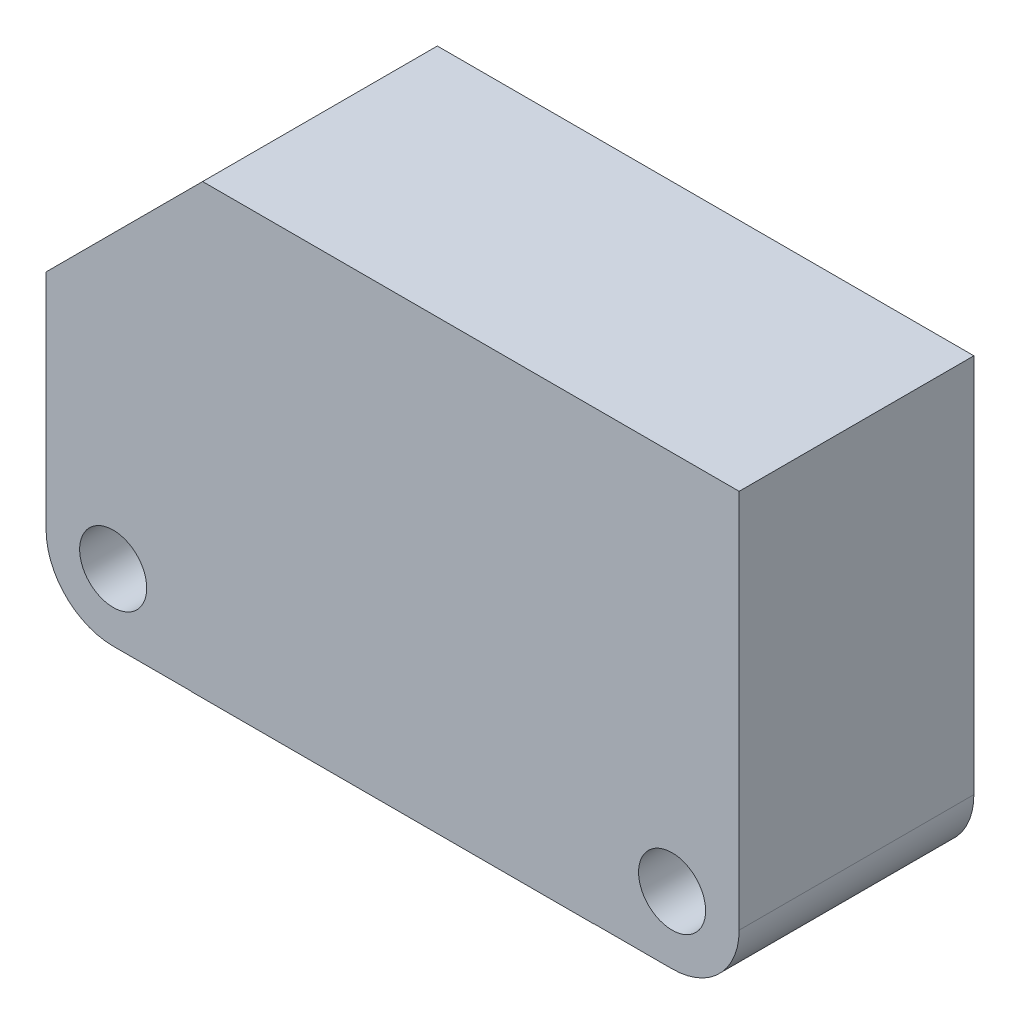
ISO-10303-21;
HEADER;
FILE_DESCRIPTION(('STEP AP214'),'2;1');
FILE_NAME('part.step','',(''),(''),'','','');
FILE_SCHEMA(('AUTOMOTIVE_DESIGN { 1 0 10303 214 1 1 1 1 }'));
ENDSEC;
DATA;
#1=APPLICATION_CONTEXT('core data for automotive mechanical design processes');
#2=APPLICATION_PROTOCOL_DEFINITION('international standard','automotive_design',2000,#1);
#3=PRODUCT_CONTEXT('',#1,'mechanical');
#4=PRODUCT('Part','Part','',(#3));
#5=PRODUCT_RELATED_PRODUCT_CATEGORY('part','',(#4));
#6=PRODUCT_DEFINITION_FORMATION('','',#4);
#7=PRODUCT_DEFINITION_CONTEXT('part definition',#1,'design');
#8=PRODUCT_DEFINITION('design','',#6,#7);
#9=PRODUCT_DEFINITION_SHAPE('','',#8);
#10=(LENGTH_UNIT() NAMED_UNIT(*) SI_UNIT(.MILLI.,.METRE.));
#11=(NAMED_UNIT(*) PLANE_ANGLE_UNIT() SI_UNIT($,.RADIAN.));
#12=(NAMED_UNIT(*) SI_UNIT($,.STERADIAN.) SOLID_ANGLE_UNIT());
#13=UNCERTAINTY_MEASURE_WITH_UNIT(LENGTH_MEASURE(1.E-05),#10,'distance_accuracy_value','');
#14=(GEOMETRIC_REPRESENTATION_CONTEXT(3) GLOBAL_UNCERTAINTY_ASSIGNED_CONTEXT((#13)) GLOBAL_UNIT_ASSIGNED_CONTEXT((#10,
#11,#12)) REPRESENTATION_CONTEXT('',''));
#15=CARTESIAN_POINT('',(0.,0.,0.));
#16=DIRECTION('',(0.,0.,1.));
#17=DIRECTION('',(1.,0.,0.));
#18=AXIS2_PLACEMENT_3D('',#15,#16,#17);
#19=CARTESIAN_POINT('',(0.,0.,-10.5));
#20=DIRECTION('',(0.,-1.,0.));
#21=DIRECTION('',(0.,0.,-1.));
#22=AXIS2_PLACEMENT_3D('',#19,#20,#21);
#23=PLANE('',#22);
#24=DIRECTION('',(1.,0.,0.));
#25=VECTOR('',#24,1.);
#26=CARTESIAN_POINT('',(0.,0.,-10.5));
#27=LINE('',#26,#25);
#28=CARTESIAN_POINT('',(3.,0.,-10.5));
#29=VERTEX_POINT('',#28);
#30=CARTESIAN_POINT('',(6.5,0.,-10.5));
#31=VERTEX_POINT('',#30);
#32=EDGE_CURVE('E163',#29,#31,#27,.T.);
#33=ORIENTED_EDGE('',*,*,#32,.T.);
#34=DIRECTION('',(0.,0.,-1.));
#35=VECTOR('',#34,1.);
#36=CARTESIAN_POINT('',(6.5,0.,0.));
#37=LINE('',#36,#35);
#38=CARTESIAN_POINT('',(6.5,0.,0.));
#39=VERTEX_POINT('',#38);
#40=EDGE_CURVE('E220',#39,#31,#37,.T.);
#41=ORIENTED_EDGE('',*,*,#40,.F.);
#42=DIRECTION('',(1.,0.,0.));
#43=VECTOR('',#42,1.);
#44=CARTESIAN_POINT('',(0.,0.,0.));
#45=LINE('',#44,#43);
#46=CARTESIAN_POINT('',(3.,0.,0.));
#47=VERTEX_POINT('',#46);
#48=EDGE_CURVE('E140',#47,#39,#45,.T.);
#49=ORIENTED_EDGE('',*,*,#48,.F.);
#50=DIRECTION('',(0.,0.,1.));
#51=VECTOR('',#50,1.);
#52=CARTESIAN_POINT('',(3.,0.,-10.5));
#53=LINE('',#52,#51);
#54=EDGE_CURVE('E188',#47,#29,#53,.F.);
#55=ORIENTED_EDGE('',*,*,#54,.T.);
#56=EDGE_LOOP('',(#33,#41,#49,#55));
#57=FACE_BOUND('',#56,.T.);
#58=ADVANCED_FACE('F34',(#57),#23,.T.);
#59=CARTESIAN_POINT('',(24.5,0.,0.));
#60=VERTEX_POINT('',#59);
#61=CARTESIAN_POINT('',(28.,0.,0.));
#62=VERTEX_POINT('',#61);
#63=EDGE_CURVE('E177',#60,#62,#45,.T.);
#64=ORIENTED_EDGE('',*,*,#63,.F.);
#65=DIRECTION('',(0.,0.,1.));
#66=VECTOR('',#65,1.);
#67=CARTESIAN_POINT('',(24.5,0.,-10.5));
#68=LINE('',#67,#66);
#69=CARTESIAN_POINT('',(24.5,0.,-10.5));
#70=VERTEX_POINT('',#69);
#71=EDGE_CURVE('E135',#70,#60,#68,.T.);
#72=ORIENTED_EDGE('',*,*,#71,.F.);
#73=CARTESIAN_POINT('',(28.,0.,-10.5));
#74=VERTEX_POINT('',#73);
#75=EDGE_CURVE('E161',#70,#74,#27,.T.);
#76=ORIENTED_EDGE('',*,*,#75,.T.);
#77=DIRECTION('',(0.,0.,1.));
#78=VECTOR('',#77,1.);
#79=CARTESIAN_POINT('',(28.,0.,-10.5));
#80=LINE('',#79,#78);
#81=EDGE_CURVE('E194',#74,#62,#80,.T.);
#82=ORIENTED_EDGE('',*,*,#81,.T.);
#83=EDGE_LOOP('',(#64,#72,#76,#82));
#84=FACE_BOUND('',#83,.T.);
#85=ADVANCED_FACE('F217',(#84),#23,.T.);
#86=CARTESIAN_POINT('',(0.,13.,-10.5));
#87=DIRECTION('',(-1.,0.,0.));
#88=DIRECTION('',(0.,-1.,0.));
#89=AXIS2_PLACEMENT_3D('',#86,#87,#88);
#90=PLANE('',#89);
#91=DIRECTION('',(0.,-1.,0.));
#92=VECTOR('',#91,1.);
#93=CARTESIAN_POINT('',(0.,13.,-10.5));
#94=LINE('',#93,#92);
#95=CARTESIAN_POINT('',(0.,13.,-10.5));
#96=VERTEX_POINT('',#95);
#97=CARTESIAN_POINT('',(0.,3.,-10.5));
#98=VERTEX_POINT('',#97);
#99=EDGE_CURVE('E159',#96,#98,#94,.T.);
#100=ORIENTED_EDGE('',*,*,#99,.T.);
#101=DIRECTION('',(0.,0.,1.));
#102=VECTOR('',#101,1.);
#103=CARTESIAN_POINT('',(0.,3.,-10.5));
#104=LINE('',#103,#102);
#105=CARTESIAN_POINT('',(0.,3.,0.));
#106=VERTEX_POINT('',#105);
#107=EDGE_CURVE('E11',#98,#106,#104,.T.);
#108=ORIENTED_EDGE('',*,*,#107,.T.);
#109=DIRECTION('',(0.,-1.,0.));
#110=VECTOR('',#109,1.);
#111=CARTESIAN_POINT('',(0.,13.,0.));
#112=LINE('',#111,#110);
#113=CARTESIAN_POINT('',(0.,13.,0.));
#114=VERTEX_POINT('',#113);
#115=EDGE_CURVE('E156',#114,#106,#112,.T.);
#116=ORIENTED_EDGE('',*,*,#115,.F.);
#117=DIRECTION('',(0.,0.,1.));
#118=VECTOR('',#117,1.);
#119=CARTESIAN_POINT('',(0.,13.,-10.5));
#120=LINE('',#119,#118);
#121=EDGE_CURVE('E186',#96,#114,#120,.T.);
#122=ORIENTED_EDGE('',*,*,#121,.F.);
#123=EDGE_LOOP('',(#100,#108,#116,#122));
#124=FACE_BOUND('',#123,.T.);
#125=ADVANCED_FACE('F233',(#124),#90,.T.);
#126=CARTESIAN_POINT('',(7.,20.,-10.5));
#127=DIRECTION('',(-0.707106781186546,0.707106781186549,0.));
#128=DIRECTION('',(-0.707106781186549,-0.707106781186546,0.));
#129=AXIS2_PLACEMENT_3D('',#126,#127,#128);
#130=PLANE('',#129);
#131=DIRECTION('',(-0.707106781186549,-0.707106781186546,0.));
#132=VECTOR('',#131,1.);
#133=CARTESIAN_POINT('',(7.,20.,0.));
#134=LINE('',#133,#132);
#135=CARTESIAN_POINT('',(7.,20.,0.));
#136=VERTEX_POINT('',#135);
#137=EDGE_CURVE('E162',#136,#114,#134,.T.);
#138=ORIENTED_EDGE('',*,*,#137,.F.);
#139=DIRECTION('',(0.,0.,1.));
#140=VECTOR('',#139,1.);
#141=CARTESIAN_POINT('',(7.,20.,-10.5));
#142=LINE('',#141,#140);
#143=CARTESIAN_POINT('',(7.,20.,-10.5));
#144=VERTEX_POINT('',#143);
#145=EDGE_CURVE('E189',#144,#136,#142,.T.);
#146=ORIENTED_EDGE('',*,*,#145,.F.);
#147=DIRECTION('',(-0.707106781186549,-0.707106781186546,0.));
#148=VECTOR('',#147,1.);
#149=CARTESIAN_POINT('',(7.,20.,-10.5));
#150=LINE('',#149,#148);
#151=EDGE_CURVE('E171',#144,#96,#150,.T.);
#152=ORIENTED_EDGE('',*,*,#151,.T.);
#153=ORIENTED_EDGE('',*,*,#121,.T.);
#154=EDGE_LOOP('',(#138,#146,#152,#153));
#155=FACE_BOUND('',#154,.T.);
#156=ADVANCED_FACE('F237',(#155),#130,.T.);
#157=CARTESIAN_POINT('',(31.,20.,-10.5));
#158=DIRECTION('',(0.,1.,0.));
#159=DIRECTION('',(0.,0.,1.));
#160=AXIS2_PLACEMENT_3D('',#157,#158,#159);
#161=PLANE('',#160);
#162=DIRECTION('',(-1.,0.,0.));
#163=VECTOR('',#162,1.);
#164=CARTESIAN_POINT('',(31.,20.,0.));
#165=LINE('',#164,#163);
#166=CARTESIAN_POINT('',(31.,20.,0.));
#167=VERTEX_POINT('',#166);
#168=EDGE_CURVE('E181',#167,#136,#165,.T.);
#169=ORIENTED_EDGE('',*,*,#168,.F.);
#170=DIRECTION('',(0.,0.,1.));
#171=VECTOR('',#170,1.);
#172=CARTESIAN_POINT('',(31.,20.,-10.5));
#173=LINE('',#172,#171);
#174=CARTESIAN_POINT('',(31.,20.,-10.5));
#175=VERTEX_POINT('',#174);
#176=EDGE_CURVE('E174',#175,#167,#173,.T.);
#177=ORIENTED_EDGE('',*,*,#176,.F.);
#178=DIRECTION('',(-1.,0.,0.));
#179=VECTOR('',#178,1.);
#180=CARTESIAN_POINT('',(31.,20.,-10.5));
#181=LINE('',#180,#179);
#182=EDGE_CURVE('E168',#175,#144,#181,.T.);
#183=ORIENTED_EDGE('',*,*,#182,.T.);
#184=ORIENTED_EDGE('',*,*,#145,.T.);
#185=EDGE_LOOP('',(#169,#177,#183,#184));
#186=FACE_BOUND('',#185,.T.);
#187=ADVANCED_FACE('F241',(#186),#161,.T.);
#188=CARTESIAN_POINT('',(31.,0.,-10.5));
#189=DIRECTION('',(1.,0.,0.));
#190=DIRECTION('',(0.,0.,-1.));
#191=AXIS2_PLACEMENT_3D('',#188,#189,#190);
#192=PLANE('',#191);
#193=DIRECTION('',(0.,1.,0.));
#194=VECTOR('',#193,1.);
#195=CARTESIAN_POINT('',(31.,0.,0.));
#196=LINE('',#195,#194);
#197=CARTESIAN_POINT('',(31.,3.,0.));
#198=VERTEX_POINT('',#197);
#199=EDGE_CURVE('E179',#198,#167,#196,.T.);
#200=ORIENTED_EDGE('',*,*,#199,.F.);
#201=DIRECTION('',(0.,0.,1.));
#202=VECTOR('',#201,1.);
#203=CARTESIAN_POINT('',(31.,3.,-10.5));
#204=LINE('',#203,#202);
#205=CARTESIAN_POINT('',(31.,3.,-10.5));
#206=VERTEX_POINT('',#205);
#207=EDGE_CURVE('E201',#198,#206,#204,.F.);
#208=ORIENTED_EDGE('',*,*,#207,.T.);
#209=DIRECTION('',(0.,1.,0.));
#210=VECTOR('',#209,1.);
#211=CARTESIAN_POINT('',(31.,0.,-10.5));
#212=LINE('',#211,#210);
#213=EDGE_CURVE('E166',#206,#175,#212,.T.);
#214=ORIENTED_EDGE('',*,*,#213,.T.);
#215=ORIENTED_EDGE('',*,*,#176,.T.);
#216=EDGE_LOOP('',(#200,#208,#214,#215));
#217=FACE_BOUND('',#216,.T.);
#218=ADVANCED_FACE('F244',(#217),#192,.T.);
#219=CARTESIAN_POINT('',(0.,0.,-10.5));
#220=DIRECTION('',(0.,0.,1.));
#221=DIRECTION('',(1.,0.,0.));
#222=AXIS2_PLACEMENT_3D('',#219,#220,#221);
#223=PLANE('',#222);
#224=CARTESIAN_POINT('',(28.,3.,-10.5));
#225=DIRECTION('',(0.,0.,1.));
#226=DIRECTION('',(1.,0.,0.));
#227=AXIS2_PLACEMENT_3D('',#224,#225,#226);
#228=CIRCLE('',#227,1.5);
#229=CARTESIAN_POINT('',(29.5,3.,-10.5));
#230=VERTEX_POINT('',#229);
#231=EDGE_CURVE('E144',#230,#230,#228,.T.);
#232=ORIENTED_EDGE('',*,*,#231,.T.);
#233=EDGE_LOOP('',(#232));
#234=FACE_BOUND('',#233,.T.);
#235=CARTESIAN_POINT('',(3.,3.,-10.5));
#236=DIRECTION('',(0.,0.,1.));
#237=DIRECTION('',(1.,0.,0.));
#238=AXIS2_PLACEMENT_3D('',#235,#236,#237);
#239=CIRCLE('',#238,1.5);
#240=CARTESIAN_POINT('',(4.5,3.,-10.5));
#241=VERTEX_POINT('',#240);
#242=EDGE_CURVE('E153',#241,#241,#239,.T.);
#243=ORIENTED_EDGE('',*,*,#242,.T.);
#244=EDGE_LOOP('',(#243));
#245=FACE_BOUND('',#244,.T.);
#246=ORIENTED_EDGE('',*,*,#213,.F.);
#247=CARTESIAN_POINT('',(28.,3.,-10.5));
#248=DIRECTION('',(0.,0.,1.));
#249=DIRECTION('',(1.,0.,0.));
#250=AXIS2_PLACEMENT_3D('',#247,#248,#249);
#251=CIRCLE('',#250,3.);
#252=EDGE_CURVE('E42',#206,#74,#251,.F.);
#253=ORIENTED_EDGE('',*,*,#252,.T.);
#254=ORIENTED_EDGE('',*,*,#75,.F.);
#255=DIRECTION('',(0.,1.,0.));
#256=VECTOR('',#255,1.);
#257=CARTESIAN_POINT('',(24.5,-0.01,-10.5));
#258=LINE('',#257,#256);
#259=CARTESIAN_POINT('',(24.5,-0.01,-10.5));
#260=VERTEX_POINT('',#259);
#261=EDGE_CURVE('E146',#260,#70,#258,.T.);
#262=ORIENTED_EDGE('',*,*,#261,.F.);
#263=DIRECTION('',(1.,0.,0.));
#264=VECTOR('',#263,1.);
#265=CARTESIAN_POINT('',(6.5,-0.01,-10.5));
#266=LINE('',#265,#264);
#267=CARTESIAN_POINT('',(6.5,-0.01,-10.5));
#268=VERTEX_POINT('',#267);
#269=EDGE_CURVE('E129',#268,#260,#266,.T.);
#270=ORIENTED_EDGE('',*,*,#269,.F.);
#271=DIRECTION('',(0.,1.,0.));
#272=VECTOR('',#271,1.);
#273=CARTESIAN_POINT('',(6.5,-0.01,-10.5));
#274=LINE('',#273,#272);
#275=EDGE_CURVE('E126',#268,#31,#274,.T.);
#276=ORIENTED_EDGE('',*,*,#275,.T.);
#277=ORIENTED_EDGE('',*,*,#32,.F.);
#278=CARTESIAN_POINT('',(3.,3.,-10.5));
#279=DIRECTION('',(0.,0.,1.));
#280=DIRECTION('',(1.,0.,0.));
#281=AXIS2_PLACEMENT_3D('',#278,#279,#280);
#282=CIRCLE('',#281,3.);
#283=EDGE_CURVE('E57',#29,#98,#282,.F.);
#284=ORIENTED_EDGE('',*,*,#283,.T.);
#285=ORIENTED_EDGE('',*,*,#99,.F.);
#286=ORIENTED_EDGE('',*,*,#151,.F.);
#287=ORIENTED_EDGE('',*,*,#182,.F.);
#288=EDGE_LOOP('',(#246,#253,#254,#262,#270,#276,#277,#284,#285,#286,#287));
#289=FACE_BOUND('',#288,.T.);
#290=ADVANCED_FACE('F208',(#234,#245,#289),#223,.F.);
#291=CARTESIAN_POINT('',(0.,0.,0.));
#292=DIRECTION('',(0.,0.,1.));
#293=DIRECTION('',(1.,0.,0.));
#294=AXIS2_PLACEMENT_3D('',#291,#292,#293);
#295=PLANE('',#294);
#296=CARTESIAN_POINT('',(28.,3.,0.));
#297=DIRECTION('',(0.,0.,1.));
#298=DIRECTION('',(1.,0.,0.));
#299=AXIS2_PLACEMENT_3D('',#296,#297,#298);
#300=CIRCLE('',#299,1.5);
#301=CARTESIAN_POINT('',(29.5,3.,0.));
#302=VERTEX_POINT('',#301);
#303=EDGE_CURVE('E141',#302,#302,#300,.T.);
#304=ORIENTED_EDGE('',*,*,#303,.F.);
#305=EDGE_LOOP('',(#304));
#306=FACE_BOUND('',#305,.T.);
#307=CARTESIAN_POINT('',(3.,3.,0.));
#308=DIRECTION('',(0.,0.,1.));
#309=DIRECTION('',(1.,0.,0.));
#310=AXIS2_PLACEMENT_3D('',#307,#308,#309);
#311=CIRCLE('',#310,1.5);
#312=CARTESIAN_POINT('',(4.5,3.,0.));
#313=VERTEX_POINT('',#312);
#314=EDGE_CURVE('E151',#313,#313,#311,.T.);
#315=ORIENTED_EDGE('',*,*,#314,.F.);
#316=EDGE_LOOP('',(#315));
#317=FACE_BOUND('',#316,.T.);
#318=ORIENTED_EDGE('',*,*,#48,.T.);
#319=DIRECTION('',(0.,1.,0.));
#320=VECTOR('',#319,1.);
#321=CARTESIAN_POINT('',(6.5,-0.01,0.));
#322=LINE('',#321,#320);
#323=CARTESIAN_POINT('',(6.5,-0.01,0.));
#324=VERTEX_POINT('',#323);
#325=EDGE_CURVE('E123',#324,#39,#322,.T.);
#326=ORIENTED_EDGE('',*,*,#325,.F.);
#327=DIRECTION('',(-1.,0.,0.));
#328=VECTOR('',#327,1.);
#329=CARTESIAN_POINT('',(24.5,-0.01,0.));
#330=LINE('',#329,#328);
#331=CARTESIAN_POINT('',(24.5,-0.01,0.));
#332=VERTEX_POINT('',#331);
#333=EDGE_CURVE('E130',#332,#324,#330,.T.);
#334=ORIENTED_EDGE('',*,*,#333,.F.);
#335=DIRECTION('',(0.,1.,0.));
#336=VECTOR('',#335,1.);
#337=CARTESIAN_POINT('',(24.5,-0.01,0.));
#338=LINE('',#337,#336);
#339=EDGE_CURVE('E49',#332,#60,#338,.T.);
#340=ORIENTED_EDGE('',*,*,#339,.T.);
#341=ORIENTED_EDGE('',*,*,#63,.T.);
#342=CARTESIAN_POINT('',(28.,3.,0.));
#343=DIRECTION('',(0.,0.,1.));
#344=DIRECTION('',(1.,0.,0.));
#345=AXIS2_PLACEMENT_3D('',#342,#343,#344);
#346=CIRCLE('',#345,3.);
#347=EDGE_CURVE('E199',#62,#198,#346,.T.);
#348=ORIENTED_EDGE('',*,*,#347,.T.);
#349=ORIENTED_EDGE('',*,*,#199,.T.);
#350=ORIENTED_EDGE('',*,*,#168,.T.);
#351=ORIENTED_EDGE('',*,*,#137,.T.);
#352=ORIENTED_EDGE('',*,*,#115,.T.);
#353=CARTESIAN_POINT('',(3.,3.,0.));
#354=DIRECTION('',(0.,0.,1.));
#355=DIRECTION('',(1.,0.,0.));
#356=AXIS2_PLACEMENT_3D('',#353,#354,#355);
#357=CIRCLE('',#356,3.);
#358=EDGE_CURVE('E197',#106,#47,#357,.T.);
#359=ORIENTED_EDGE('',*,*,#358,.T.);
#360=EDGE_LOOP('',(#318,#326,#334,#340,#341,#348,#349,#350,#351,#352,#359));
#361=FACE_BOUND('',#360,.T.);
#362=ADVANCED_FACE('F138',(#306,#317,#361),#295,.T.);
#363=CARTESIAN_POINT('',(3.,3.,-10.5));
#364=DIRECTION('',(0.,0.,1.));
#365=DIRECTION('',(1.,0.,0.));
#366=AXIS2_PLACEMENT_3D('',#363,#364,#365);
#367=CYLINDRICAL_SURFACE('',#366,1.5);
#368=CARTESIAN_POINT('',(4.5,3.,-10.5));
#369=CARTESIAN_POINT('',(4.5,3.,-10.390625));
#370=CARTESIAN_POINT('',(4.5,3.,-10.28125));
#371=CARTESIAN_POINT('',(4.5,3.,-10.0625));
#372=CARTESIAN_POINT('',(4.5,3.,-9.953125));
#373=CARTESIAN_POINT('',(4.5,3.,-9.734375));
#374=CARTESIAN_POINT('',(4.5,3.,-9.625));
#375=CARTESIAN_POINT('',(4.5,3.,-9.40625));
#376=CARTESIAN_POINT('',(4.5,3.,-9.296875));
#377=CARTESIAN_POINT('',(4.5,3.,-9.078125));
#378=CARTESIAN_POINT('',(4.5,3.,-8.96875));
#379=CARTESIAN_POINT('',(4.5,3.,-8.75));
#380=CARTESIAN_POINT('',(4.5,3.,-8.640625));
#381=CARTESIAN_POINT('',(4.5,3.,-8.421875));
#382=CARTESIAN_POINT('',(4.5,3.,-8.3125));
#383=CARTESIAN_POINT('',(4.5,3.,-8.09375));
#384=CARTESIAN_POINT('',(4.5,3.,-7.984375));
#385=CARTESIAN_POINT('',(4.5,3.,-7.765625));
#386=CARTESIAN_POINT('',(4.5,3.,-7.65625));
#387=CARTESIAN_POINT('',(4.5,3.,-7.4375));
#388=CARTESIAN_POINT('',(4.5,3.,-7.328125));
#389=CARTESIAN_POINT('',(4.5,3.,-7.109375));
#390=CARTESIAN_POINT('',(4.5,3.,-7.));
#391=CARTESIAN_POINT('',(4.5,3.,-6.78125));
#392=CARTESIAN_POINT('',(4.5,3.,-6.671875));
#393=CARTESIAN_POINT('',(4.5,3.,-6.453125));
#394=CARTESIAN_POINT('',(4.5,3.,-6.34375));
#395=CARTESIAN_POINT('',(4.5,3.,-6.125));
#396=CARTESIAN_POINT('',(4.5,3.,-6.015625));
#397=CARTESIAN_POINT('',(4.5,3.,-5.796875));
#398=CARTESIAN_POINT('',(4.5,3.,-5.6875));
#399=CARTESIAN_POINT('',(4.5,3.,-5.46875));
#400=CARTESIAN_POINT('',(4.5,3.,-5.359375));
#401=CARTESIAN_POINT('',(4.5,3.,-5.140625));
#402=CARTESIAN_POINT('',(4.5,3.,-5.03125));
#403=CARTESIAN_POINT('',(4.5,3.,-4.8125));
#404=CARTESIAN_POINT('',(4.5,3.,-4.703125));
#405=CARTESIAN_POINT('',(4.5,3.,-4.484375));
#406=CARTESIAN_POINT('',(4.5,3.,-4.375));
#407=CARTESIAN_POINT('',(4.5,3.,-4.15625));
#408=CARTESIAN_POINT('',(4.5,3.,-4.046875));
#409=CARTESIAN_POINT('',(4.5,3.,-3.828125));
#410=CARTESIAN_POINT('',(4.5,3.,-3.71875));
#411=CARTESIAN_POINT('',(4.5,3.,-3.5));
#412=CARTESIAN_POINT('',(4.5,3.,-3.390625));
#413=CARTESIAN_POINT('',(4.5,3.,-3.171875));
#414=CARTESIAN_POINT('',(4.5,3.,-3.0625));
#415=CARTESIAN_POINT('',(4.5,3.,-2.84375));
#416=CARTESIAN_POINT('',(4.5,3.,-2.734375));
#417=CARTESIAN_POINT('',(4.5,3.,-2.515625));
#418=CARTESIAN_POINT('',(4.5,3.,-2.40625));
#419=CARTESIAN_POINT('',(4.5,3.,-2.1875));
#420=CARTESIAN_POINT('',(4.5,3.,-2.078125));
#421=CARTESIAN_POINT('',(4.5,3.,-1.859375));
#422=CARTESIAN_POINT('',(4.5,3.,-1.75));
#423=CARTESIAN_POINT('',(4.5,3.,-1.53125));
#424=CARTESIAN_POINT('',(4.5,3.,-1.421875));
#425=CARTESIAN_POINT('',(4.5,3.,-1.203125));
#426=CARTESIAN_POINT('',(4.5,3.,-1.09375));
#427=CARTESIAN_POINT('',(4.5,3.,-0.875000000000001));
#428=CARTESIAN_POINT('',(4.5,3.,-0.765625000000001));
#429=CARTESIAN_POINT('',(4.5,3.,-0.546875));
#430=CARTESIAN_POINT('',(4.5,3.,-0.4375));
#431=CARTESIAN_POINT('',(4.5,3.,-0.21875));
#432=CARTESIAN_POINT('',(4.5,3.,-0.109375));
#433=CARTESIAN_POINT('',(4.5,3.,0.));
#434=B_SPLINE_CURVE_WITH_KNOTS('',3,(#368,#369,#370,#371,#372,#373,#374,#375,#376,#377,#378,
#379,#380,#381,#382,#383,#384,#385,#386,#387,#388,#389,#390,#391,#392,#393,#394,#395,#396,#397,
#398,#399,#400,#401,#402,#403,#404,#405,#406,#407,#408,#409,#410,#411,#412,#413,#414,#415,#416,
#417,#418,#419,#420,#421,#422,#423,#424,#425,#426,#427,#428,#429,#430,#431,#432,#433),
.UNSPECIFIED.,.F.,.F.,(4,2,2,2,2,2,2,2,2,2,2,2,2,2,2,2,2,2,2,2,2,2,2,2,2,2,2,2,2,2,2,2,4),(0.,
0.328124999999999,0.656249999999999,0.984374999999999,1.3125,1.640625,1.96875,2.296875,2.625,
2.953125,3.28125,3.609375,3.9375,4.265625,4.59375,4.921875,5.25,5.578125,5.90625,6.234375,
6.5625,6.890625,7.21875,7.546875,7.875,8.203125,8.53125,8.859375,9.1875,9.515625,9.84375,
10.171875,10.5),.UNSPECIFIED.);
#435=EDGE_CURVE('BSEAM267',#241,#313,#434,.T.);
#436=ORIENTED_EDGE('',*,*,#242,.F.);
#437=ORIENTED_EDGE('',*,*,#314,.T.);
#438=ORIENTED_EDGE('',*,*,#435,.T.);
#439=ORIENTED_EDGE('',*,*,#435,.F.);
#440=EDGE_LOOP('',(#436,#438,#437,#439));
#441=FACE_BOUND('',#440,.T.);
#442=ADVANCED_FACE('F267',(#441),#367,.F.);
#443=CARTESIAN_POINT('',(28.,3.,-10.5));
#444=DIRECTION('',(0.,0.,1.));
#445=DIRECTION('',(1.,0.,0.));
#446=AXIS2_PLACEMENT_3D('',#443,#444,#445);
#447=CYLINDRICAL_SURFACE('',#446,1.5);
#448=CARTESIAN_POINT('',(29.5,3.,-10.5));
#449=CARTESIAN_POINT('',(29.5,3.,-10.390625));
#450=CARTESIAN_POINT('',(29.5,3.,-10.28125));
#451=CARTESIAN_POINT('',(29.5,3.,-10.0625));
#452=CARTESIAN_POINT('',(29.5,3.,-9.953125));
#453=CARTESIAN_POINT('',(29.5,3.,-9.734375));
#454=CARTESIAN_POINT('',(29.5,3.,-9.625));
#455=CARTESIAN_POINT('',(29.5,3.,-9.40625));
#456=CARTESIAN_POINT('',(29.5,3.,-9.296875));
#457=CARTESIAN_POINT('',(29.5,3.,-9.078125));
#458=CARTESIAN_POINT('',(29.5,3.,-8.96875));
#459=CARTESIAN_POINT('',(29.5,3.,-8.75));
#460=CARTESIAN_POINT('',(29.5,3.,-8.640625));
#461=CARTESIAN_POINT('',(29.5,3.,-8.421875));
#462=CARTESIAN_POINT('',(29.5,3.,-8.3125));
#463=CARTESIAN_POINT('',(29.5,3.,-8.09375));
#464=CARTESIAN_POINT('',(29.5,3.,-7.984375));
#465=CARTESIAN_POINT('',(29.5,3.,-7.765625));
#466=CARTESIAN_POINT('',(29.5,3.,-7.65625));
#467=CARTESIAN_POINT('',(29.5,3.,-7.4375));
#468=CARTESIAN_POINT('',(29.5,3.,-7.328125));
#469=CARTESIAN_POINT('',(29.5,3.,-7.109375));
#470=CARTESIAN_POINT('',(29.5,3.,-7.));
#471=CARTESIAN_POINT('',(29.5,3.,-6.78125));
#472=CARTESIAN_POINT('',(29.5,3.,-6.671875));
#473=CARTESIAN_POINT('',(29.5,3.,-6.453125));
#474=CARTESIAN_POINT('',(29.5,3.,-6.34375));
#475=CARTESIAN_POINT('',(29.5,3.,-6.125));
#476=CARTESIAN_POINT('',(29.5,3.,-6.015625));
#477=CARTESIAN_POINT('',(29.5,3.,-5.796875));
#478=CARTESIAN_POINT('',(29.5,3.,-5.6875));
#479=CARTESIAN_POINT('',(29.5,3.,-5.46875));
#480=CARTESIAN_POINT('',(29.5,3.,-5.359375));
#481=CARTESIAN_POINT('',(29.5,3.,-5.140625));
#482=CARTESIAN_POINT('',(29.5,3.,-5.03125));
#483=CARTESIAN_POINT('',(29.5,3.,-4.8125));
#484=CARTESIAN_POINT('',(29.5,3.,-4.703125));
#485=CARTESIAN_POINT('',(29.5,3.,-4.484375));
#486=CARTESIAN_POINT('',(29.5,3.,-4.375));
#487=CARTESIAN_POINT('',(29.5,3.,-4.15625));
#488=CARTESIAN_POINT('',(29.5,3.,-4.046875));
#489=CARTESIAN_POINT('',(29.5,3.,-3.828125));
#490=CARTESIAN_POINT('',(29.5,3.,-3.71875));
#491=CARTESIAN_POINT('',(29.5,3.,-3.5));
#492=CARTESIAN_POINT('',(29.5,3.,-3.390625));
#493=CARTESIAN_POINT('',(29.5,3.,-3.171875));
#494=CARTESIAN_POINT('',(29.5,3.,-3.0625));
#495=CARTESIAN_POINT('',(29.5,3.,-2.84375));
#496=CARTESIAN_POINT('',(29.5,3.,-2.734375));
#497=CARTESIAN_POINT('',(29.5,3.,-2.515625));
#498=CARTESIAN_POINT('',(29.5,3.,-2.40625));
#499=CARTESIAN_POINT('',(29.5,3.,-2.1875));
#500=CARTESIAN_POINT('',(29.5,3.,-2.078125));
#501=CARTESIAN_POINT('',(29.5,3.,-1.859375));
#502=CARTESIAN_POINT('',(29.5,3.,-1.75));
#503=CARTESIAN_POINT('',(29.5,3.,-1.53125));
#504=CARTESIAN_POINT('',(29.5,3.,-1.421875));
#505=CARTESIAN_POINT('',(29.5,3.,-1.203125));
#506=CARTESIAN_POINT('',(29.5,3.,-1.09375));
#507=CARTESIAN_POINT('',(29.5,3.,-0.875000000000001));
#508=CARTESIAN_POINT('',(29.5,3.,-0.765625000000001));
#509=CARTESIAN_POINT('',(29.5,3.,-0.546875));
#510=CARTESIAN_POINT('',(29.5,3.,-0.4375));
#511=CARTESIAN_POINT('',(29.5,3.,-0.21875));
#512=CARTESIAN_POINT('',(29.5,3.,-0.109375));
#513=CARTESIAN_POINT('',(29.5,3.,0.));
#514=B_SPLINE_CURVE_WITH_KNOTS('',3,(#448,#449,#450,#451,#452,#453,#454,#455,#456,#457,#458,
#459,#460,#461,#462,#463,#464,#465,#466,#467,#468,#469,#470,#471,#472,#473,#474,#475,#476,#477,
#478,#479,#480,#481,#482,#483,#484,#485,#486,#487,#488,#489,#490,#491,#492,#493,#494,#495,#496,
#497,#498,#499,#500,#501,#502,#503,#504,#505,#506,#507,#508,#509,#510,#511,#512,#513),
.UNSPECIFIED.,.F.,.F.,(4,2,2,2,2,2,2,2,2,2,2,2,2,2,2,2,2,2,2,2,2,2,2,2,2,2,2,2,2,2,2,2,4),(0.,
0.328124999999999,0.656249999999999,0.984374999999999,1.3125,1.640625,1.96875,2.296875,2.625,
2.953125,3.28125,3.609375,3.9375,4.265625,4.59375,4.921875,5.25,5.578125,5.90625,6.234375,
6.5625,6.890625,7.21875,7.546875,7.875,8.203125,8.53125,8.859375,9.1875,9.515625,9.84375,
10.171875,10.5),.UNSPECIFIED.);
#515=EDGE_CURVE('BSEAM262',#230,#302,#514,.T.);
#516=ORIENTED_EDGE('',*,*,#231,.F.);
#517=ORIENTED_EDGE('',*,*,#303,.T.);
#518=ORIENTED_EDGE('',*,*,#515,.T.);
#519=ORIENTED_EDGE('',*,*,#515,.F.);
#520=EDGE_LOOP('',(#516,#518,#517,#519));
#521=FACE_BOUND('',#520,.T.);
#522=ADVANCED_FACE('F262',(#521),#447,.F.);
#523=CARTESIAN_POINT('',(28.,3.,-10.5));
#524=DIRECTION('',(0.,0.,1.));
#525=DIRECTION('',(1.,0.,0.));
#526=AXIS2_PLACEMENT_3D('',#523,#524,#525);
#527=CYLINDRICAL_SURFACE('',#526,3.);
#528=ORIENTED_EDGE('',*,*,#252,.F.);
#529=ORIENTED_EDGE('',*,*,#207,.F.);
#530=ORIENTED_EDGE('',*,*,#347,.F.);
#531=ORIENTED_EDGE('',*,*,#81,.F.);
#532=EDGE_LOOP('',(#528,#529,#530,#531));
#533=FACE_BOUND('',#532,.T.);
#534=ADVANCED_FACE('F214',(#533),#527,.T.);
#535=CARTESIAN_POINT('',(3.,3.,-10.5));
#536=DIRECTION('',(0.,0.,1.));
#537=DIRECTION('',(1.,0.,0.));
#538=AXIS2_PLACEMENT_3D('',#535,#536,#537);
#539=CYLINDRICAL_SURFACE('',#538,3.);
#540=ORIENTED_EDGE('',*,*,#283,.F.);
#541=ORIENTED_EDGE('',*,*,#54,.F.);
#542=ORIENTED_EDGE('',*,*,#358,.F.);
#543=ORIENTED_EDGE('',*,*,#107,.F.);
#544=EDGE_LOOP('',(#540,#541,#542,#543));
#545=FACE_BOUND('',#544,.T.);
#546=ADVANCED_FACE('F36',(#545),#539,.T.);
#547=CARTESIAN_POINT('',(6.5,-0.01,0.));
#548=DIRECTION('',(1.,0.,0.));
#549=DIRECTION('',(0.,0.,-1.));
#550=AXIS2_PLACEMENT_3D('',#547,#548,#549);
#551=PLANE('',#550);
#552=ORIENTED_EDGE('',*,*,#40,.T.);
#553=ORIENTED_EDGE('',*,*,#275,.F.);
#554=DIRECTION('',(0.,0.,-1.));
#555=VECTOR('',#554,1.);
#556=CARTESIAN_POINT('',(6.5,-0.01,0.));
#557=LINE('',#556,#555);
#558=EDGE_CURVE('E119',#324,#268,#557,.T.);
#559=ORIENTED_EDGE('',*,*,#558,.F.);
#560=ORIENTED_EDGE('',*,*,#325,.T.);
#561=EDGE_LOOP('',(#552,#553,#559,#560));
#562=FACE_BOUND('',#561,.T.);
#563=ADVANCED_FACE('F121',(#562),#551,.F.);
#564=CARTESIAN_POINT('',(24.5,-0.01,-10.5));
#565=DIRECTION('',(-1.,0.,0.));
#566=DIRECTION('',(0.,0.,1.));
#567=AXIS2_PLACEMENT_3D('',#564,#565,#566);
#568=PLANE('',#567);
#569=ORIENTED_EDGE('',*,*,#71,.T.);
#570=ORIENTED_EDGE('',*,*,#339,.F.);
#571=DIRECTION('',(0.,0.,1.));
#572=VECTOR('',#571,1.);
#573=CARTESIAN_POINT('',(24.5,-0.01,-10.5));
#574=LINE('',#573,#572);
#575=EDGE_CURVE('E134',#260,#332,#574,.T.);
#576=ORIENTED_EDGE('',*,*,#575,.F.);
#577=ORIENTED_EDGE('',*,*,#261,.T.);
#578=EDGE_LOOP('',(#569,#570,#576,#577));
#579=FACE_BOUND('',#578,.T.);
#580=ADVANCED_FACE('F225',(#579),#568,.F.);
#581=CARTESIAN_POINT('',(6.5,-0.01,0.));
#582=DIRECTION('',(0.,-1.,0.));
#583=DIRECTION('',(0.,0.,-1.));
#584=AXIS2_PLACEMENT_3D('',#581,#582,#583);
#585=PLANE('',#584);
#586=ORIENTED_EDGE('',*,*,#333,.T.);
#587=ORIENTED_EDGE('',*,*,#558,.T.);
#588=ORIENTED_EDGE('',*,*,#269,.T.);
#589=ORIENTED_EDGE('',*,*,#575,.T.);
#590=EDGE_LOOP('',(#586,#587,#588,#589));
#591=FACE_BOUND('',#590,.T.);
#592=ADVANCED_FACE('F132',(#591),#585,.T.);
#593=CLOSED_SHELL('',(#58,#85,#125,#156,#187,#218,#290,#362,#442,#522,#534,#546,#563,#580,#592));
#594=MANIFOLD_SOLID_BREP('B2',#593);
#595=ADVANCED_BREP_SHAPE_REPRESENTATION('',(#18,#594),#14);
#596=SHAPE_DEFINITION_REPRESENTATION(#9,#595);
ENDSEC;
END-ISO-10303-21;
